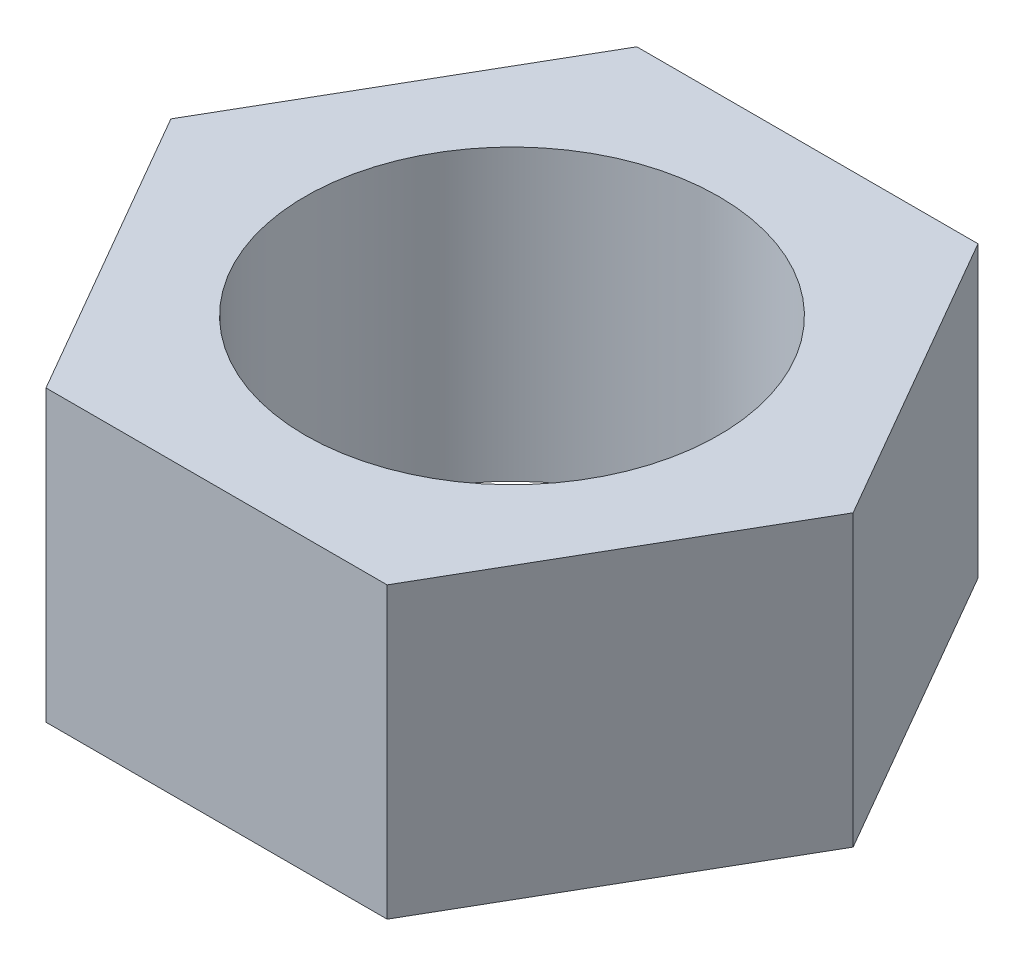
ISO-10303-21;
HEADER;
FILE_DESCRIPTION(('STEP AP214'),'2;1');
FILE_NAME('part.step','',(''),(''),'','','');
FILE_SCHEMA(('AUTOMOTIVE_DESIGN { 1 0 10303 214 1 1 1 1 }'));
ENDSEC;
DATA;
#1=APPLICATION_CONTEXT('core data for automotive mechanical design processes');
#2=APPLICATION_PROTOCOL_DEFINITION('international standard','automotive_design',2000,#1);
#3=PRODUCT_CONTEXT('',#1,'mechanical');
#4=PRODUCT('Part','Part','',(#3));
#5=PRODUCT_RELATED_PRODUCT_CATEGORY('part','',(#4));
#6=PRODUCT_DEFINITION_FORMATION('','',#4);
#7=PRODUCT_DEFINITION_CONTEXT('part definition',#1,'design');
#8=PRODUCT_DEFINITION('design','',#6,#7);
#9=PRODUCT_DEFINITION_SHAPE('','',#8);
#10=(LENGTH_UNIT() NAMED_UNIT(*) SI_UNIT(.MILLI.,.METRE.));
#11=(NAMED_UNIT(*) PLANE_ANGLE_UNIT() SI_UNIT($,.RADIAN.));
#12=(NAMED_UNIT(*) SI_UNIT($,.STERADIAN.) SOLID_ANGLE_UNIT());
#13=UNCERTAINTY_MEASURE_WITH_UNIT(LENGTH_MEASURE(1.E-05),#10,'distance_accuracy_value','');
#14=(GEOMETRIC_REPRESENTATION_CONTEXT(3) GLOBAL_UNCERTAINTY_ASSIGNED_CONTEXT((#13)) GLOBAL_UNIT_ASSIGNED_CONTEXT((#10,
#11,#12)) REPRESENTATION_CONTEXT('',''));
#15=CARTESIAN_POINT('',(0.,0.,0.));
#16=DIRECTION('',(0.,0.,1.));
#17=DIRECTION('',(1.,0.,0.));
#18=AXIS2_PLACEMENT_3D('',#15,#16,#17);
#19=CARTESIAN_POINT('',(2.9329393674833,2.4892,0.));
#20=DIRECTION('',(-0.866025403784439,0.,0.5));
#21=DIRECTION('',(0.5,0.,0.866025403784439));
#22=AXIS2_PLACEMENT_3D('',#19,#20,#21);
#23=PLANE('',#22);
#24=DIRECTION('',(-0.5,0.,-0.866025403784439));
#25=VECTOR('',#24,1.);
#26=CARTESIAN_POINT('',(2.9329393674833,0.,0.));
#27=LINE('',#26,#25);
#28=CARTESIAN_POINT('',(2.9329393674833,0.,0.));
#29=VERTEX_POINT('',#28);
#30=CARTESIAN_POINT('',(1.46646968374165,0.,-2.54));
#31=VERTEX_POINT('',#30);
#32=EDGE_CURVE('E119',#29,#31,#27,.T.);
#33=ORIENTED_EDGE('',*,*,#32,.T.);
#34=DIRECTION('',(0.,-1.,0.));
#35=VECTOR('',#34,1.);
#36=CARTESIAN_POINT('',(1.46646968374165,2.4892,-2.54));
#37=LINE('',#36,#35);
#38=CARTESIAN_POINT('',(1.46646968374165,2.4892,-2.54));
#39=VERTEX_POINT('',#38);
#40=EDGE_CURVE('E11',#39,#31,#37,.T.);
#41=ORIENTED_EDGE('',*,*,#40,.F.);
#42=DIRECTION('',(-0.5,0.,-0.866025403784439));
#43=VECTOR('',#42,1.);
#44=CARTESIAN_POINT('',(2.9329393674833,2.4892,0.));
#45=LINE('',#44,#43);
#46=CARTESIAN_POINT('',(2.9329393674833,2.4892,0.));
#47=VERTEX_POINT('',#46);
#48=EDGE_CURVE('E130',#47,#39,#45,.T.);
#49=ORIENTED_EDGE('',*,*,#48,.F.);
#50=DIRECTION('',(0.,-1.,0.));
#51=VECTOR('',#50,1.);
#52=CARTESIAN_POINT('',(2.9329393674833,2.4892,0.));
#53=LINE('',#52,#51);
#54=EDGE_CURVE('E115',#47,#29,#53,.T.);
#55=ORIENTED_EDGE('',*,*,#54,.T.);
#56=EDGE_LOOP('',(#33,#41,#49,#55));
#57=FACE_BOUND('',#56,.T.);
#58=ADVANCED_FACE('F35',(#57),#23,.F.);
#59=CARTESIAN_POINT('',(1.46646968374165,2.4892,-2.54));
#60=DIRECTION('',(0.,0.,1.));
#61=DIRECTION('',(1.,0.,0.));
#62=AXIS2_PLACEMENT_3D('',#59,#60,#61);
#63=PLANE('',#62);
#64=DIRECTION('',(-1.,0.,0.));
#65=VECTOR('',#64,1.);
#66=CARTESIAN_POINT('',(1.46646968374165,0.,-2.54));
#67=LINE('',#66,#65);
#68=CARTESIAN_POINT('',(-1.46646968374165,0.,-2.54));
#69=VERTEX_POINT('',#68);
#70=EDGE_CURVE('E122',#31,#69,#67,.T.);
#71=ORIENTED_EDGE('',*,*,#70,.T.);
#72=DIRECTION('',(0.,-1.,0.));
#73=VECTOR('',#72,1.);
#74=CARTESIAN_POINT('',(-1.46646968374165,2.4892,-2.54));
#75=LINE('',#74,#73);
#76=CARTESIAN_POINT('',(-1.46646968374165,2.4892,-2.54));
#77=VERTEX_POINT('',#76);
#78=EDGE_CURVE('E43',#77,#69,#75,.T.);
#79=ORIENTED_EDGE('',*,*,#78,.F.);
#80=DIRECTION('',(-1.,0.,0.));
#81=VECTOR('',#80,1.);
#82=CARTESIAN_POINT('',(1.46646968374165,2.4892,-2.54));
#83=LINE('',#82,#81);
#84=EDGE_CURVE('E88',#39,#77,#83,.T.);
#85=ORIENTED_EDGE('',*,*,#84,.F.);
#86=ORIENTED_EDGE('',*,*,#40,.T.);
#87=EDGE_LOOP('',(#71,#79,#85,#86));
#88=FACE_BOUND('',#87,.T.);
#89=ADVANCED_FACE('F155',(#88),#63,.F.);
#90=CARTESIAN_POINT('',(-1.46646968374165,2.4892,-2.54));
#91=DIRECTION('',(0.866025403784439,0.,0.5));
#92=DIRECTION('',(0.5,0.,-0.866025403784439));
#93=AXIS2_PLACEMENT_3D('',#90,#91,#92);
#94=PLANE('',#93);
#95=DIRECTION('',(-0.5,0.,0.866025403784439));
#96=VECTOR('',#95,1.);
#97=CARTESIAN_POINT('',(-1.46646968374165,0.,-2.54));
#98=LINE('',#97,#96);
#99=CARTESIAN_POINT('',(-2.9329393674833,0.,0.));
#100=VERTEX_POINT('',#99);
#101=EDGE_CURVE('E125',#69,#100,#98,.T.);
#102=ORIENTED_EDGE('',*,*,#101,.T.);
#103=DIRECTION('',(0.,-1.,0.));
#104=VECTOR('',#103,1.);
#105=CARTESIAN_POINT('',(-2.9329393674833,2.4892,0.));
#106=LINE('',#105,#104);
#107=CARTESIAN_POINT('',(-2.9329393674833,2.4892,0.));
#108=VERTEX_POINT('',#107);
#109=EDGE_CURVE('E110',#108,#100,#106,.T.);
#110=ORIENTED_EDGE('',*,*,#109,.F.);
#111=DIRECTION('',(-0.5,0.,0.866025403784439));
#112=VECTOR('',#111,1.);
#113=CARTESIAN_POINT('',(-1.46646968374165,2.4892,-2.54));
#114=LINE('',#113,#112);
#115=EDGE_CURVE('E101',#77,#108,#114,.T.);
#116=ORIENTED_EDGE('',*,*,#115,.F.);
#117=ORIENTED_EDGE('',*,*,#78,.T.);
#118=EDGE_LOOP('',(#102,#110,#116,#117));
#119=FACE_BOUND('',#118,.T.);
#120=ADVANCED_FACE('F136',(#119),#94,.F.);
#121=CARTESIAN_POINT('',(-2.9329393674833,2.4892,0.));
#122=DIRECTION('',(0.866025403784438,0.,-0.5));
#123=DIRECTION('',(-0.5,0.,-0.866025403784438));
#124=AXIS2_PLACEMENT_3D('',#121,#122,#123);
#125=PLANE('',#124);
#126=DIRECTION('',(0.5,0.,0.866025403784438));
#127=VECTOR('',#126,1.);
#128=CARTESIAN_POINT('',(-2.9329393674833,0.,0.));
#129=LINE('',#128,#127);
#130=CARTESIAN_POINT('',(-1.46646968374165,0.,2.54));
#131=VERTEX_POINT('',#130);
#132=EDGE_CURVE('E109',#100,#131,#129,.T.);
#133=ORIENTED_EDGE('',*,*,#132,.T.);
#134=DIRECTION('',(0.,-1.,0.));
#135=VECTOR('',#134,1.);
#136=CARTESIAN_POINT('',(-1.46646968374165,2.4892,2.54));
#137=LINE('',#136,#135);
#138=CARTESIAN_POINT('',(-1.46646968374165,2.4892,2.54));
#139=VERTEX_POINT('',#138);
#140=EDGE_CURVE('E106',#139,#131,#137,.T.);
#141=ORIENTED_EDGE('',*,*,#140,.F.);
#142=DIRECTION('',(0.5,0.,0.866025403784438));
#143=VECTOR('',#142,1.);
#144=CARTESIAN_POINT('',(-2.9329393674833,2.4892,0.));
#145=LINE('',#144,#143);
#146=EDGE_CURVE('E95',#108,#139,#145,.T.);
#147=ORIENTED_EDGE('',*,*,#146,.F.);
#148=ORIENTED_EDGE('',*,*,#109,.T.);
#149=EDGE_LOOP('',(#133,#141,#147,#148));
#150=FACE_BOUND('',#149,.T.);
#151=ADVANCED_FACE('F107',(#150),#125,.F.);
#152=CARTESIAN_POINT('',(-1.46646968374165,2.4892,2.54));
#153=DIRECTION('',(0.,0.,-1.));
#154=DIRECTION('',(-1.,0.,0.));
#155=AXIS2_PLACEMENT_3D('',#152,#153,#154);
#156=PLANE('',#155);
#157=DIRECTION('',(1.,0.,0.));
#158=VECTOR('',#157,1.);
#159=CARTESIAN_POINT('',(-1.46646968374165,0.,2.54));
#160=LINE('',#159,#158);
#161=CARTESIAN_POINT('',(1.46646968374165,0.,2.54));
#162=VERTEX_POINT('',#161);
#163=EDGE_CURVE('E74',#131,#162,#160,.T.);
#164=ORIENTED_EDGE('',*,*,#163,.T.);
#165=DIRECTION('',(0.,-1.,0.));
#166=VECTOR('',#165,1.);
#167=CARTESIAN_POINT('',(1.46646968374165,2.4892,2.54));
#168=LINE('',#167,#166);
#169=CARTESIAN_POINT('',(1.46646968374165,2.4892,2.54));
#170=VERTEX_POINT('',#169);
#171=EDGE_CURVE('E111',#170,#162,#168,.T.);
#172=ORIENTED_EDGE('',*,*,#171,.F.);
#173=DIRECTION('',(1.,0.,0.));
#174=VECTOR('',#173,1.);
#175=CARTESIAN_POINT('',(-1.46646968374165,2.4892,2.54));
#176=LINE('',#175,#174);
#177=EDGE_CURVE('E99',#139,#170,#176,.T.);
#178=ORIENTED_EDGE('',*,*,#177,.F.);
#179=ORIENTED_EDGE('',*,*,#140,.T.);
#180=EDGE_LOOP('',(#164,#172,#178,#179));
#181=FACE_BOUND('',#180,.T.);
#182=ADVANCED_FACE('F113',(#181),#156,.F.);
#183=CARTESIAN_POINT('',(1.46646968374165,2.4892,2.54));
#184=DIRECTION('',(-0.866025403784439,0.,-0.5));
#185=DIRECTION('',(-0.5,0.,0.866025403784439));
#186=AXIS2_PLACEMENT_3D('',#183,#184,#185);
#187=PLANE('',#186);
#188=DIRECTION('',(0.5,0.,-0.866025403784439));
#189=VECTOR('',#188,1.);
#190=CARTESIAN_POINT('',(1.46646968374165,0.,2.54));
#191=LINE('',#190,#189);
#192=EDGE_CURVE('E80',#162,#29,#191,.T.);
#193=ORIENTED_EDGE('',*,*,#192,.T.);
#194=ORIENTED_EDGE('',*,*,#54,.F.);
#195=DIRECTION('',(0.5,0.,-0.866025403784439));
#196=VECTOR('',#195,1.);
#197=CARTESIAN_POINT('',(1.46646968374165,2.4892,2.54));
#198=LINE('',#197,#196);
#199=EDGE_CURVE('E51',#170,#47,#198,.T.);
#200=ORIENTED_EDGE('',*,*,#199,.F.);
#201=ORIENTED_EDGE('',*,*,#171,.T.);
#202=EDGE_LOOP('',(#193,#194,#200,#201));
#203=FACE_BOUND('',#202,.T.);
#204=ADVANCED_FACE('F143',(#203),#187,.F.);
#205=CARTESIAN_POINT('',(0.,2.4892,0.));
#206=DIRECTION('',(0.,1.,0.));
#207=DIRECTION('',(0.,0.,1.));
#208=AXIS2_PLACEMENT_3D('',#205,#206,#207);
#209=PLANE('',#208);
#210=CARTESIAN_POINT('',(0.,2.4892,0.));
#211=DIRECTION('',(0.,1.,0.));
#212=DIRECTION('',(0.,0.,1.));
#213=AXIS2_PLACEMENT_3D('',#210,#211,#212);
#214=CIRCLE('',#213,1.778);
#215=CARTESIAN_POINT('',(0.,2.4892,1.778));
#216=VERTEX_POINT('',#215);
#217=EDGE_CURVE('E210',#216,#216,#214,.T.);
#218=ORIENTED_EDGE('',*,*,#217,.F.);
#219=EDGE_LOOP('',(#218));
#220=FACE_BOUND('',#219,.T.);
#221=ORIENTED_EDGE('',*,*,#48,.T.);
#222=ORIENTED_EDGE('',*,*,#84,.T.);
#223=ORIENTED_EDGE('',*,*,#115,.T.);
#224=ORIENTED_EDGE('',*,*,#146,.T.);
#225=ORIENTED_EDGE('',*,*,#177,.T.);
#226=ORIENTED_EDGE('',*,*,#199,.T.);
#227=EDGE_LOOP('',(#221,#222,#223,#224,#225,#226));
#228=FACE_BOUND('',#227,.T.);
#229=ADVANCED_FACE('F97',(#220,#228),#209,.T.);
#230=CARTESIAN_POINT('',(0.,0.,0.));
#231=DIRECTION('',(0.,1.,0.));
#232=DIRECTION('',(0.,0.,1.));
#233=AXIS2_PLACEMENT_3D('',#230,#231,#232);
#234=PLANE('',#233);
#235=CARTESIAN_POINT('',(0.,0.,0.));
#236=DIRECTION('',(0.,1.,0.));
#237=DIRECTION('',(0.,0.,1.));
#238=AXIS2_PLACEMENT_3D('',#235,#236,#237);
#239=CIRCLE('',#238,1.778);
#240=CARTESIAN_POINT('',(0.,0.,1.778));
#241=VERTEX_POINT('',#240);
#242=EDGE_CURVE('E123',#241,#241,#239,.T.);
#243=ORIENTED_EDGE('',*,*,#242,.T.);
#244=EDGE_LOOP('',(#243));
#245=FACE_BOUND('',#244,.T.);
#246=ORIENTED_EDGE('',*,*,#32,.F.);
#247=ORIENTED_EDGE('',*,*,#192,.F.);
#248=ORIENTED_EDGE('',*,*,#163,.F.);
#249=ORIENTED_EDGE('',*,*,#132,.F.);
#250=ORIENTED_EDGE('',*,*,#101,.F.);
#251=ORIENTED_EDGE('',*,*,#70,.F.);
#252=EDGE_LOOP('',(#246,#247,#248,#249,#250,#251));
#253=FACE_BOUND('',#252,.T.);
#254=ADVANCED_FACE('F139',(#245,#253),#234,.F.);
#255=CARTESIAN_POINT('',(0.,0.,0.));
#256=DIRECTION('',(0.,1.,0.));
#257=DIRECTION('',(0.,0.,1.));
#258=AXIS2_PLACEMENT_3D('',#255,#256,#257);
#259=CYLINDRICAL_SURFACE('',#258,1.778);
#260=ORIENTED_EDGE('',*,*,#242,.F.);
#261=EDGE_LOOP('',(#260));
#262=FACE_BOUND('',#261,.T.);
#263=ORIENTED_EDGE('',*,*,#217,.T.);
#264=EDGE_LOOP('',(#263));
#265=FACE_BOUND('',#264,.T.);
#266=ADVANCED_FACE('F192',(#262,#265),#259,.F.);
#267=CLOSED_SHELL('',(#58,#89,#120,#151,#182,#204,#229,#254,#266));
#268=MANIFOLD_SOLID_BREP('B2',#267);
#269=ADVANCED_BREP_SHAPE_REPRESENTATION('',(#18,#268),#14);
#270=SHAPE_DEFINITION_REPRESENTATION(#9,#269);
ENDSEC;
END-ISO-10303-21;
